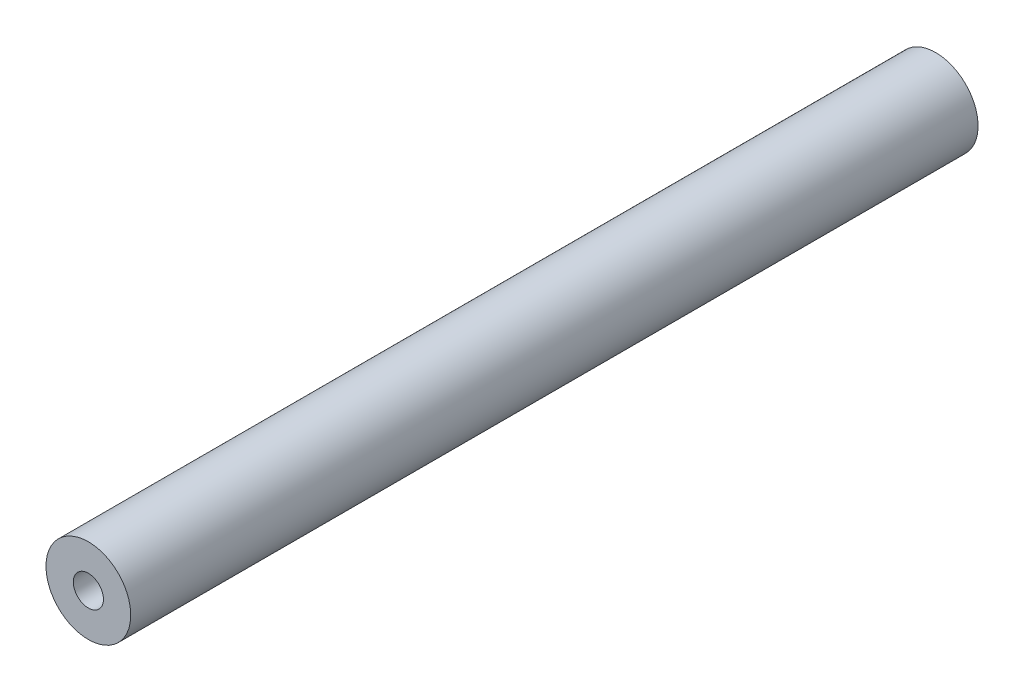
ISO-10303-21;
HEADER;
FILE_DESCRIPTION(('STEP AP214'),'2;1');
FILE_NAME('part.step','',(''),(''),'','','');
FILE_SCHEMA(('AUTOMOTIVE_DESIGN { 1 0 10303 214 1 1 1 1 }'));
ENDSEC;
DATA;
#1=APPLICATION_CONTEXT('core data for automotive mechanical design processes');
#2=APPLICATION_PROTOCOL_DEFINITION('international standard','automotive_design',2000,#1);
#3=PRODUCT_CONTEXT('',#1,'mechanical');
#4=PRODUCT('Part','Part','',(#3));
#5=PRODUCT_RELATED_PRODUCT_CATEGORY('part','',(#4));
#6=PRODUCT_DEFINITION_FORMATION('','',#4);
#7=PRODUCT_DEFINITION_CONTEXT('part definition',#1,'design');
#8=PRODUCT_DEFINITION('design','',#6,#7);
#9=PRODUCT_DEFINITION_SHAPE('','',#8);
#10=(LENGTH_UNIT() NAMED_UNIT(*) SI_UNIT(.MILLI.,.METRE.));
#11=(NAMED_UNIT(*) PLANE_ANGLE_UNIT() SI_UNIT($,.RADIAN.));
#12=(NAMED_UNIT(*) SI_UNIT($,.STERADIAN.) SOLID_ANGLE_UNIT());
#13=UNCERTAINTY_MEASURE_WITH_UNIT(LENGTH_MEASURE(1.E-05),#10,'distance_accuracy_value','');
#14=(GEOMETRIC_REPRESENTATION_CONTEXT(3) GLOBAL_UNCERTAINTY_ASSIGNED_CONTEXT((#13)) GLOBAL_UNIT_ASSIGNED_CONTEXT((#10,
#11,#12)) REPRESENTATION_CONTEXT('',''));
#15=CARTESIAN_POINT('',(0.,0.,0.));
#16=DIRECTION('',(0.,0.,1.));
#17=DIRECTION('',(1.,0.,0.));
#18=AXIS2_PLACEMENT_3D('',#15,#16,#17);
#19=CARTESIAN_POINT('',(0.,0.,90.));
#20=DIRECTION('',(0.,0.,-1.));
#21=DIRECTION('',(-1.,0.,0.));
#22=AXIS2_PLACEMENT_3D('',#19,#20,#21);
#23=CYLINDRICAL_SURFACE('',#22,4.5);
#24=CARTESIAN_POINT('',(0.,0.,90.));
#25=DIRECTION('',(0.,0.,1.));
#26=DIRECTION('',(1.,0.,0.));
#27=AXIS2_PLACEMENT_3D('',#24,#25,#26);
#28=CIRCLE('',#27,4.5);
#29=CARTESIAN_POINT('',(-4.5,0.,90.));
#30=VERTEX_POINT('',#29);
#31=EDGE_CURVE('E10',#30,#30,#28,.T.);
#32=CARTESIAN_POINT('',(0.,0.,0.));
#33=DIRECTION('',(0.,0.,1.));
#34=DIRECTION('',(1.,0.,0.));
#35=AXIS2_PLACEMENT_3D('',#32,#33,#34);
#36=CIRCLE('',#35,4.5);
#37=CARTESIAN_POINT('',(-4.5,0.,0.));
#38=VERTEX_POINT('',#37);
#39=EDGE_CURVE('E40',#38,#38,#36,.T.);
#40=CARTESIAN_POINT('',(-4.5,0.,90.));
#41=CARTESIAN_POINT('',(-4.5,0.,89.0625));
#42=CARTESIAN_POINT('',(-4.5,0.,88.125));
#43=CARTESIAN_POINT('',(-4.5,0.,86.25));
#44=CARTESIAN_POINT('',(-4.5,0.,85.3125));
#45=CARTESIAN_POINT('',(-4.5,0.,83.4375));
#46=CARTESIAN_POINT('',(-4.5,0.,82.5));
#47=CARTESIAN_POINT('',(-4.5,0.,80.625));
#48=CARTESIAN_POINT('',(-4.5,0.,79.6875));
#49=CARTESIAN_POINT('',(-4.5,0.,77.8125));
#50=CARTESIAN_POINT('',(-4.5,0.,76.875));
#51=CARTESIAN_POINT('',(-4.5,0.,75.));
#52=CARTESIAN_POINT('',(-4.5,0.,74.0625));
#53=CARTESIAN_POINT('',(-4.5,0.,72.1875));
#54=CARTESIAN_POINT('',(-4.5,0.,71.25));
#55=CARTESIAN_POINT('',(-4.5,0.,69.375));
#56=CARTESIAN_POINT('',(-4.5,0.,68.4375));
#57=CARTESIAN_POINT('',(-4.5,0.,66.5625));
#58=CARTESIAN_POINT('',(-4.5,0.,65.625));
#59=CARTESIAN_POINT('',(-4.5,0.,63.75));
#60=CARTESIAN_POINT('',(-4.5,0.,62.8125));
#61=CARTESIAN_POINT('',(-4.5,0.,60.9375));
#62=CARTESIAN_POINT('',(-4.5,0.,60.));
#63=CARTESIAN_POINT('',(-4.5,0.,58.125));
#64=CARTESIAN_POINT('',(-4.5,0.,57.1875));
#65=CARTESIAN_POINT('',(-4.5,0.,55.3125));
#66=CARTESIAN_POINT('',(-4.5,0.,54.375));
#67=CARTESIAN_POINT('',(-4.5,0.,52.5));
#68=CARTESIAN_POINT('',(-4.5,0.,51.5625));
#69=CARTESIAN_POINT('',(-4.5,0.,49.6875));
#70=CARTESIAN_POINT('',(-4.5,0.,48.75));
#71=CARTESIAN_POINT('',(-4.5,0.,46.875));
#72=CARTESIAN_POINT('',(-4.5,0.,45.9375));
#73=CARTESIAN_POINT('',(-4.5,0.,44.0625));
#74=CARTESIAN_POINT('',(-4.5,0.,43.125));
#75=CARTESIAN_POINT('',(-4.5,0.,41.25));
#76=CARTESIAN_POINT('',(-4.5,0.,40.3125));
#77=CARTESIAN_POINT('',(-4.5,0.,38.4375));
#78=CARTESIAN_POINT('',(-4.5,0.,37.5));
#79=CARTESIAN_POINT('',(-4.5,0.,35.625));
#80=CARTESIAN_POINT('',(-4.5,0.,34.6875));
#81=CARTESIAN_POINT('',(-4.5,0.,32.8125));
#82=CARTESIAN_POINT('',(-4.5,0.,31.875));
#83=CARTESIAN_POINT('',(-4.5,0.,30.));
#84=CARTESIAN_POINT('',(-4.5,0.,29.0625));
#85=CARTESIAN_POINT('',(-4.5,0.,27.1875));
#86=CARTESIAN_POINT('',(-4.5,0.,26.25));
#87=CARTESIAN_POINT('',(-4.5,0.,24.375));
#88=CARTESIAN_POINT('',(-4.5,0.,23.4375));
#89=CARTESIAN_POINT('',(-4.5,0.,21.5625));
#90=CARTESIAN_POINT('',(-4.5,0.,20.625));
#91=CARTESIAN_POINT('',(-4.5,0.,18.75));
#92=CARTESIAN_POINT('',(-4.5,0.,17.8125));
#93=CARTESIAN_POINT('',(-4.5,0.,15.9375));
#94=CARTESIAN_POINT('',(-4.5,0.,15.));
#95=CARTESIAN_POINT('',(-4.5,0.,13.125));
#96=CARTESIAN_POINT('',(-4.5,0.,12.1875));
#97=CARTESIAN_POINT('',(-4.5,0.,10.3125));
#98=CARTESIAN_POINT('',(-4.5,0.,9.37499999999999));
#99=CARTESIAN_POINT('',(-4.5,0.,7.49999999999999));
#100=CARTESIAN_POINT('',(-4.5,0.,6.56249999999999));
#101=CARTESIAN_POINT('',(-4.5,0.,4.68749999999999));
#102=CARTESIAN_POINT('',(-4.5,0.,3.74999999999998));
#103=CARTESIAN_POINT('',(-4.5,0.,1.87499999999998));
#104=CARTESIAN_POINT('',(-4.5,0.,0.937499999999986));
#105=CARTESIAN_POINT('',(-4.5,0.,0.));
#106=B_SPLINE_CURVE_WITH_KNOTS('',3,(#40,#41,#42,#43,#44,#45,#46,#47,#48,#49,#50,#51,#52,#53,
#54,#55,#56,#57,#58,#59,#60,#61,#62,#63,#64,#65,#66,#67,#68,#69,#70,#71,#72,#73,#74,#75,#76,#77,
#78,#79,#80,#81,#82,#83,#84,#85,#86,#87,#88,#89,#90,#91,#92,#93,#94,#95,#96,#97,#98,#99,#100,
#101,#102,#103,#104,#105),.UNSPECIFIED.,.F.,.F.,(4,2,2,2,2,2,2,2,2,2,2,2,2,2,2,2,2,2,2,2,2,2,2,
2,2,2,2,2,2,2,2,2,4),(0.,2.81250000000001,5.62500000000001,8.43750000000001,11.25,14.0625,
16.875,19.6875,22.5,25.3125,28.125,30.9375,33.75,36.5625,39.375,42.1875,45.,47.8125,50.625,
53.4375,56.25,59.0625,61.875,64.6875,67.5,70.3125,73.125,75.9375,78.75,81.5625,84.375,87.1875,
90.),.UNSPECIFIED.);
#107=EDGE_CURVE('BSEAM37',#30,#38,#106,.T.);
#108=ORIENTED_EDGE('',*,*,#31,.F.);
#109=ORIENTED_EDGE('',*,*,#39,.T.);
#110=ORIENTED_EDGE('',*,*,#107,.T.);
#111=ORIENTED_EDGE('',*,*,#107,.F.);
#112=EDGE_LOOP('',(#108,#110,#109,#111));
#113=FACE_BOUND('',#112,.T.);
#114=ADVANCED_FACE('F37',(#113),#23,.T.);
#115=CARTESIAN_POINT('',(0.,0.,90.));
#116=DIRECTION('',(0.,0.,1.));
#117=DIRECTION('',(1.,0.,0.));
#118=AXIS2_PLACEMENT_3D('',#115,#116,#117);
#119=PLANE('',#118);
#120=CARTESIAN_POINT('',(0.,0.,90.));
#121=DIRECTION('',(0.,0.,1.));
#122=DIRECTION('',(1.,0.,0.));
#123=AXIS2_PLACEMENT_3D('',#120,#121,#122);
#124=CIRCLE('',#123,1.6);
#125=CARTESIAN_POINT('',(1.6,0.,90.));
#126=VERTEX_POINT('',#125);
#127=EDGE_CURVE('E51',#126,#126,#124,.T.);
#128=ORIENTED_EDGE('',*,*,#127,.F.);
#129=EDGE_LOOP('',(#128));
#130=FACE_BOUND('',#129,.T.);
#131=ORIENTED_EDGE('',*,*,#31,.T.);
#132=EDGE_LOOP('',(#131));
#133=FACE_BOUND('',#132,.T.);
#134=ADVANCED_FACE('F80',(#130,#133),#119,.T.);
#135=CARTESIAN_POINT('',(0.,0.,0.));
#136=DIRECTION('',(0.,0.,1.));
#137=DIRECTION('',(1.,0.,0.));
#138=AXIS2_PLACEMENT_3D('',#135,#136,#137);
#139=PLANE('',#138);
#140=CARTESIAN_POINT('',(0.,0.,0.));
#141=DIRECTION('',(0.,0.,-1.));
#142=DIRECTION('',(-1.,0.,0.));
#143=AXIS2_PLACEMENT_3D('',#140,#141,#142);
#144=CIRCLE('',#143,1.6);
#145=CARTESIAN_POINT('',(-1.6,0.,0.));
#146=VERTEX_POINT('',#145);
#147=EDGE_CURVE('E59',#146,#146,#144,.T.);
#148=ORIENTED_EDGE('',*,*,#147,.F.);
#149=EDGE_LOOP('',(#148));
#150=FACE_BOUND('',#149,.T.);
#151=ORIENTED_EDGE('',*,*,#39,.F.);
#152=EDGE_LOOP('',(#151));
#153=FACE_BOUND('',#152,.T.);
#154=ADVANCED_FACE('F76',(#150,#153),#139,.F.);
#155=CARTESIAN_POINT('',(0.,0.,85.5));
#156=DIRECTION('',(0.,0.,1.));
#157=DIRECTION('',(1.,0.,0.));
#158=AXIS2_PLACEMENT_3D('',#155,#156,#157);
#159=CYLINDRICAL_SURFACE('',#158,1.6);
#160=CARTESIAN_POINT('',(0.,0.,85.5));
#161=DIRECTION('',(0.,0.,1.));
#162=DIRECTION('',(1.,0.,0.));
#163=AXIS2_PLACEMENT_3D('',#160,#161,#162);
#164=CIRCLE('',#163,1.6);
#165=CARTESIAN_POINT('',(1.6,0.,85.5));
#166=VERTEX_POINT('',#165);
#167=EDGE_CURVE('E49',#166,#166,#164,.T.);
#168=ORIENTED_EDGE('',*,*,#167,.F.);
#169=EDGE_LOOP('',(#168));
#170=FACE_BOUND('',#169,.T.);
#171=ORIENTED_EDGE('',*,*,#127,.T.);
#172=EDGE_LOOP('',(#171));
#173=FACE_BOUND('',#172,.T.);
#174=ADVANCED_FACE('F79',(#170,#173),#159,.F.);
#175=CARTESIAN_POINT('',(0.,0.,85.5));
#176=DIRECTION('',(0.,0.,1.));
#177=DIRECTION('',(1.,0.,0.));
#178=AXIS2_PLACEMENT_3D('',#175,#176,#177);
#179=PLANE('',#178);
#180=ORIENTED_EDGE('',*,*,#167,.T.);
#181=EDGE_LOOP('',(#180));
#182=FACE_BOUND('',#181,.T.);
#183=ADVANCED_FACE('F72',(#182),#179,.T.);
#184=CARTESIAN_POINT('',(0.,0.,4.5));
#185=DIRECTION('',(0.,0.,-1.));
#186=DIRECTION('',(-1.,0.,0.));
#187=AXIS2_PLACEMENT_3D('',#184,#185,#186);
#188=CYLINDRICAL_SURFACE('',#187,1.6);
#189=CARTESIAN_POINT('',(0.,0.,4.5));
#190=DIRECTION('',(0.,0.,-1.));
#191=DIRECTION('',(-1.,0.,0.));
#192=AXIS2_PLACEMENT_3D('',#189,#190,#191);
#193=CIRCLE('',#192,1.6);
#194=CARTESIAN_POINT('',(-1.6,0.,4.5));
#195=VERTEX_POINT('',#194);
#196=EDGE_CURVE('E55',#195,#195,#193,.T.);
#197=ORIENTED_EDGE('',*,*,#196,.F.);
#198=EDGE_LOOP('',(#197));
#199=FACE_BOUND('',#198,.T.);
#200=ORIENTED_EDGE('',*,*,#147,.T.);
#201=EDGE_LOOP('',(#200));
#202=FACE_BOUND('',#201,.T.);
#203=ADVANCED_FACE('F69',(#199,#202),#188,.F.);
#204=CARTESIAN_POINT('',(0.,0.,4.5));
#205=DIRECTION('',(0.,0.,-1.));
#206=DIRECTION('',(-1.,0.,0.));
#207=AXIS2_PLACEMENT_3D('',#204,#205,#206);
#208=PLANE('',#207);
#209=ORIENTED_EDGE('',*,*,#196,.T.);
#210=EDGE_LOOP('',(#209));
#211=FACE_BOUND('',#210,.T.);
#212=ADVANCED_FACE('F67',(#211),#208,.T.);
#213=CLOSED_SHELL('',(#114,#134,#154,#174,#183,#203,#212));
#214=MANIFOLD_SOLID_BREP('B2',#213);
#215=ADVANCED_BREP_SHAPE_REPRESENTATION('',(#18,#214),#14);
#216=SHAPE_DEFINITION_REPRESENTATION(#9,#215);
ENDSEC;
END-ISO-10303-21;
